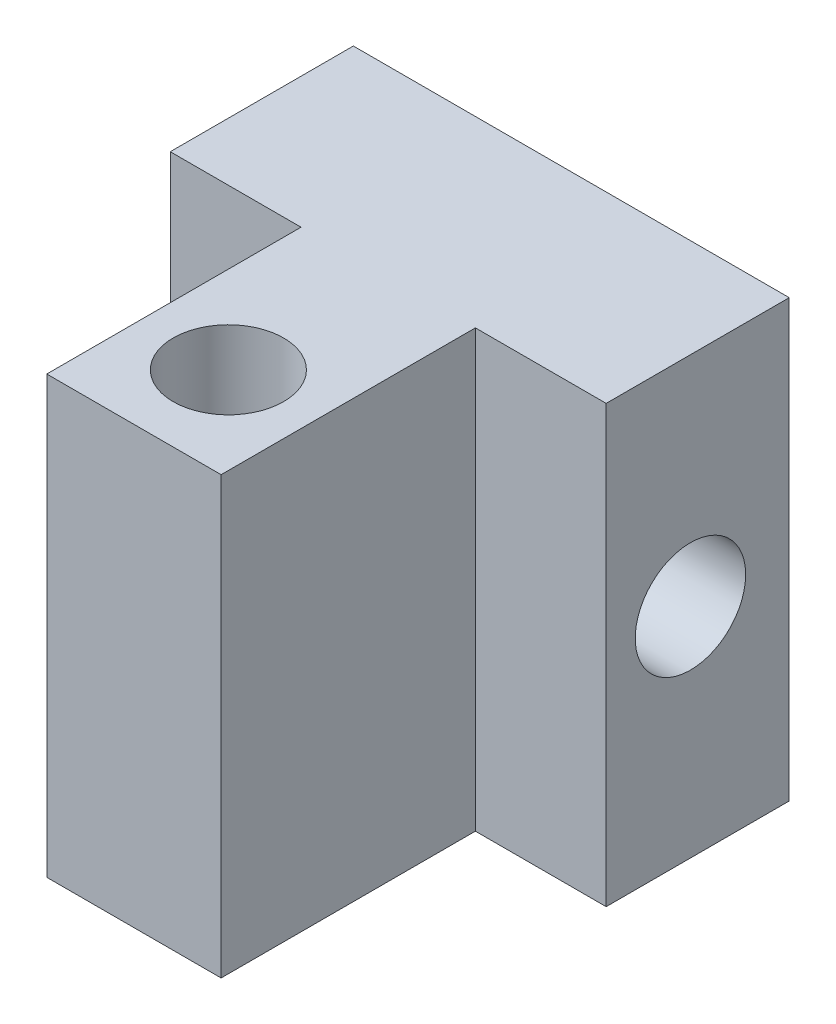
ISO-10303-21;
HEADER;
FILE_DESCRIPTION(('STEP AP214'),'2;1');
FILE_NAME('part.step','',(''),(''),'','','');
FILE_SCHEMA(('AUTOMOTIVE_DESIGN { 1 0 10303 214 1 1 1 1 }'));
ENDSEC;
DATA;
#1=APPLICATION_CONTEXT('core data for automotive mechanical design processes');
#2=APPLICATION_PROTOCOL_DEFINITION('international standard','automotive_design',2000,#1);
#3=PRODUCT_CONTEXT('',#1,'mechanical');
#4=PRODUCT('Part','Part','',(#3));
#5=PRODUCT_RELATED_PRODUCT_CATEGORY('part','',(#4));
#6=PRODUCT_DEFINITION_FORMATION('','',#4);
#7=PRODUCT_DEFINITION_CONTEXT('part definition',#1,'design');
#8=PRODUCT_DEFINITION('design','',#6,#7);
#9=PRODUCT_DEFINITION_SHAPE('','',#8);
#10=(LENGTH_UNIT() NAMED_UNIT(*) SI_UNIT(.MILLI.,.METRE.));
#11=(NAMED_UNIT(*) PLANE_ANGLE_UNIT() SI_UNIT($,.RADIAN.));
#12=(NAMED_UNIT(*) SI_UNIT($,.STERADIAN.) SOLID_ANGLE_UNIT());
#13=UNCERTAINTY_MEASURE_WITH_UNIT(LENGTH_MEASURE(1.E-05),#10,'distance_accuracy_value','');
#14=(GEOMETRIC_REPRESENTATION_CONTEXT(3) GLOBAL_UNCERTAINTY_ASSIGNED_CONTEXT((#13)) GLOBAL_UNIT_ASSIGNED_CONTEXT((#10,
#11,#12)) REPRESENTATION_CONTEXT('',''));
#15=CARTESIAN_POINT('',(0.,0.,0.));
#16=DIRECTION('',(0.,0.,1.));
#17=DIRECTION('',(1.,0.,0.));
#18=AXIS2_PLACEMENT_3D('',#15,#16,#17);
#19=CARTESIAN_POINT('',(-60.,0.,60.2));
#20=DIRECTION('',(1.,0.,0.));
#21=DIRECTION('',(0.,1.,0.));
#22=AXIS2_PLACEMENT_3D('',#19,#20,#21);
#23=PLANE('',#22);
#24=CARTESIAN_POINT('',(-60.,30.,13.6));
#25=DIRECTION('',(1.,0.,0.));
#26=DIRECTION('',(0.,0.,-1.));
#27=AXIS2_PLACEMENT_3D('',#24,#25,#26);
#28=CIRCLE('',#27,7.60000000000001);
#29=CARTESIAN_POINT('',(-60.,30.,5.99999999999999));
#30=VERTEX_POINT('',#29);
#31=EDGE_CURVE('E142',#30,#30,#28,.T.);
#32=ORIENTED_EDGE('',*,*,#31,.T.);
#33=EDGE_LOOP('',(#32));
#34=FACE_BOUND('',#33,.T.);
#35=DIRECTION('',(0.,-1.,0.));
#36=VECTOR('',#35,1.);
#37=CARTESIAN_POINT('',(-60.,60.,25.2));
#38=LINE('',#37,#36);
#39=CARTESIAN_POINT('',(-60.,60.,25.2));
#40=VERTEX_POINT('',#39);
#41=CARTESIAN_POINT('',(-60.,0.,25.2));
#42=VERTEX_POINT('',#41);
#43=EDGE_CURVE('E170',#40,#42,#38,.T.);
#44=ORIENTED_EDGE('',*,*,#43,.F.);
#45=DIRECTION('',(0.,0.,-1.));
#46=VECTOR('',#45,1.);
#47=CARTESIAN_POINT('',(-60.,60.,60.2));
#48=LINE('',#47,#46);
#49=CARTESIAN_POINT('',(-60.,60.,0.));
#50=VERTEX_POINT('',#49);
#51=EDGE_CURVE('E126',#40,#50,#48,.T.);
#52=ORIENTED_EDGE('',*,*,#51,.T.);
#53=DIRECTION('',(0.,-1.,0.));
#54=VECTOR('',#53,1.);
#55=CARTESIAN_POINT('',(-60.,0.,0.));
#56=LINE('',#55,#54);
#57=CARTESIAN_POINT('',(-60.,0.,0.));
#58=VERTEX_POINT('',#57);
#59=EDGE_CURVE('E132',#50,#58,#56,.T.);
#60=ORIENTED_EDGE('',*,*,#59,.T.);
#61=DIRECTION('',(0.,0.,-1.));
#62=VECTOR('',#61,1.);
#63=CARTESIAN_POINT('',(-60.,0.,60.2));
#64=LINE('',#63,#62);
#65=EDGE_CURVE('E127',#42,#58,#64,.T.);
#66=ORIENTED_EDGE('',*,*,#65,.F.);
#67=EDGE_LOOP('',(#44,#52,#60,#66));
#68=FACE_BOUND('',#67,.T.);
#69=ADVANCED_FACE('F36',(#34,#68),#23,.F.);
#70=CARTESIAN_POINT('',(0.,0.,60.2));
#71=DIRECTION('',(0.,1.,0.));
#72=DIRECTION('',(-1.,0.,0.));
#73=AXIS2_PLACEMENT_3D('',#70,#71,#72);
#74=PLANE('',#73);
#75=DIRECTION('',(1.,0.,0.));
#76=VECTOR('',#75,1.);
#77=CARTESIAN_POINT('',(0.,0.,25.2));
#78=LINE('',#77,#76);
#79=CARTESIAN_POINT('',(-18.,0.,25.2));
#80=VERTEX_POINT('',#79);
#81=CARTESIAN_POINT('',(0.,0.,25.2));
#82=VERTEX_POINT('',#81);
#83=EDGE_CURVE('E108',#80,#82,#78,.T.);
#84=ORIENTED_EDGE('',*,*,#83,.F.);
#85=DIRECTION('',(0.,0.,1.));
#86=VECTOR('',#85,1.);
#87=CARTESIAN_POINT('',(-18.,0.,25.2));
#88=LINE('',#87,#86);
#89=CARTESIAN_POINT('',(-18.,0.,60.2));
#90=VERTEX_POINT('',#89);
#91=EDGE_CURVE('E165',#80,#90,#88,.T.);
#92=ORIENTED_EDGE('',*,*,#91,.T.);
#93=DIRECTION('',(1.,0.,0.));
#94=VECTOR('',#93,1.);
#95=CARTESIAN_POINT('',(0.,0.,60.2));
#96=LINE('',#95,#94);
#97=CARTESIAN_POINT('',(-42.,0.,60.2));
#98=VERTEX_POINT('',#97);
#99=EDGE_CURVE('E135',#98,#90,#96,.T.);
#100=ORIENTED_EDGE('',*,*,#99,.F.);
#101=DIRECTION('',(0.,0.,1.));
#102=VECTOR('',#101,1.);
#103=CARTESIAN_POINT('',(-42.,0.,25.2));
#104=LINE('',#103,#102);
#105=CARTESIAN_POINT('',(-42.,0.,25.2));
#106=VERTEX_POINT('',#105);
#107=EDGE_CURVE('E59',#106,#98,#104,.T.);
#108=ORIENTED_EDGE('',*,*,#107,.F.);
#109=DIRECTION('',(1.,0.,0.));
#110=VECTOR('',#109,1.);
#111=CARTESIAN_POINT('',(-60.,0.,25.2));
#112=LINE('',#111,#110);
#113=EDGE_CURVE('E168',#42,#106,#112,.T.);
#114=ORIENTED_EDGE('',*,*,#113,.F.);
#115=ORIENTED_EDGE('',*,*,#65,.T.);
#116=DIRECTION('',(1.,0.,0.));
#117=VECTOR('',#116,1.);
#118=CARTESIAN_POINT('',(0.,0.,0.));
#119=LINE('',#118,#117);
#120=CARTESIAN_POINT('',(0.,0.,0.));
#121=VERTEX_POINT('',#120);
#122=EDGE_CURVE('E139',#58,#121,#119,.T.);
#123=ORIENTED_EDGE('',*,*,#122,.T.);
#124=DIRECTION('',(0.,0.,-1.));
#125=VECTOR('',#124,1.);
#126=CARTESIAN_POINT('',(0.,0.,60.2));
#127=LINE('',#126,#125);
#128=EDGE_CURVE('E11',#82,#121,#127,.T.);
#129=ORIENTED_EDGE('',*,*,#128,.F.);
#130=EDGE_LOOP('',(#84,#92,#100,#108,#114,#115,#123,#129));
#131=FACE_BOUND('',#130,.T.);
#132=CARTESIAN_POINT('',(-30.,0.,47.2));
#133=DIRECTION('',(0.,-1.,0.));
#134=DIRECTION('',(1.,0.,0.));
#135=AXIS2_PLACEMENT_3D('',#132,#133,#134);
#136=CIRCLE('',#135,7.6);
#137=CARTESIAN_POINT('',(-30.,0.,54.8));
#138=VERTEX_POINT('',#137);
#139=EDGE_CURVE('E149',#138,#138,#136,.T.);
#140=ORIENTED_EDGE('',*,*,#139,.F.);
#141=EDGE_LOOP('',(#140));
#142=FACE_BOUND('',#141,.T.);
#143=ADVANCED_FACE('F38',(#131,#142),#74,.F.);
#144=CARTESIAN_POINT('',(-60.,60.,60.2));
#145=DIRECTION('',(0.,-1.,0.));
#146=DIRECTION('',(1.,0.,0.));
#147=AXIS2_PLACEMENT_3D('',#144,#145,#146);
#148=PLANE('',#147);
#149=DIRECTION('',(-1.,0.,0.));
#150=VECTOR('',#149,1.);
#151=CARTESIAN_POINT('',(-60.,60.,60.2));
#152=LINE('',#151,#150);
#153=CARTESIAN_POINT('',(-18.,60.,60.2));
#154=VERTEX_POINT('',#153);
#155=CARTESIAN_POINT('',(-42.,60.,60.2));
#156=VERTEX_POINT('',#155);
#157=EDGE_CURVE('E131',#154,#156,#152,.T.);
#158=ORIENTED_EDGE('',*,*,#157,.F.);
#159=DIRECTION('',(0.,0.,1.));
#160=VECTOR('',#159,1.);
#161=CARTESIAN_POINT('',(-18.,60.,25.2));
#162=LINE('',#161,#160);
#163=CARTESIAN_POINT('',(-18.,60.,25.2));
#164=VERTEX_POINT('',#163);
#165=EDGE_CURVE('E51',#164,#154,#162,.T.);
#166=ORIENTED_EDGE('',*,*,#165,.F.);
#167=DIRECTION('',(-1.,0.,0.));
#168=VECTOR('',#167,1.);
#169=CARTESIAN_POINT('',(-18.,60.,25.2));
#170=LINE('',#169,#168);
#171=CARTESIAN_POINT('',(0.,60.,25.2));
#172=VERTEX_POINT('',#171);
#173=EDGE_CURVE('E106',#172,#164,#170,.T.);
#174=ORIENTED_EDGE('',*,*,#173,.F.);
#175=DIRECTION('',(0.,0.,-1.));
#176=VECTOR('',#175,1.);
#177=CARTESIAN_POINT('',(0.,60.,60.2));
#178=LINE('',#177,#176);
#179=CARTESIAN_POINT('',(0.,60.,0.));
#180=VERTEX_POINT('',#179);
#181=EDGE_CURVE('E44',#172,#180,#178,.T.);
#182=ORIENTED_EDGE('',*,*,#181,.T.);
#183=DIRECTION('',(-1.,0.,0.));
#184=VECTOR('',#183,1.);
#185=CARTESIAN_POINT('',(-60.,60.,0.));
#186=LINE('',#185,#184);
#187=EDGE_CURVE('E136',#180,#50,#186,.T.);
#188=ORIENTED_EDGE('',*,*,#187,.T.);
#189=ORIENTED_EDGE('',*,*,#51,.F.);
#190=DIRECTION('',(-1.,0.,0.));
#191=VECTOR('',#190,1.);
#192=CARTESIAN_POINT('',(-42.,60.,25.2));
#193=LINE('',#192,#191);
#194=CARTESIAN_POINT('',(-42.,60.,25.2));
#195=VERTEX_POINT('',#194);
#196=EDGE_CURVE('E164',#195,#40,#193,.T.);
#197=ORIENTED_EDGE('',*,*,#196,.F.);
#198=DIRECTION('',(0.,0.,1.));
#199=VECTOR('',#198,1.);
#200=CARTESIAN_POINT('',(-42.,60.,25.2));
#201=LINE('',#200,#199);
#202=EDGE_CURVE('E155',#195,#156,#201,.T.);
#203=ORIENTED_EDGE('',*,*,#202,.T.);
#204=EDGE_LOOP('',(#158,#166,#174,#182,#188,#189,#197,#203));
#205=FACE_BOUND('',#204,.T.);
#206=CARTESIAN_POINT('',(-30.,60.,47.2));
#207=DIRECTION('',(0.,-1.,0.));
#208=DIRECTION('',(1.,0.,0.));
#209=AXIS2_PLACEMENT_3D('',#206,#207,#208);
#210=CIRCLE('',#209,7.6);
#211=CARTESIAN_POINT('',(-30.,60.,54.8));
#212=VERTEX_POINT('',#211);
#213=EDGE_CURVE('E152',#212,#212,#210,.T.);
#214=ORIENTED_EDGE('',*,*,#213,.T.);
#215=EDGE_LOOP('',(#214));
#216=FACE_BOUND('',#215,.T.);
#217=ADVANCED_FACE('F116',(#205,#216),#148,.F.);
#218=CARTESIAN_POINT('',(0.,0.,60.2));
#219=DIRECTION('',(-1.,0.,0.));
#220=DIRECTION('',(0.,0.,1.));
#221=AXIS2_PLACEMENT_3D('',#218,#219,#220);
#222=PLANE('',#221);
#223=CARTESIAN_POINT('',(0.,30.,13.6));
#224=DIRECTION('',(1.,0.,0.));
#225=DIRECTION('',(0.,0.,-1.));
#226=AXIS2_PLACEMENT_3D('',#223,#224,#225);
#227=CIRCLE('',#226,7.60000000000001);
#228=CARTESIAN_POINT('',(0.,30.,5.99999999999999));
#229=VERTEX_POINT('',#228);
#230=EDGE_CURVE('E146',#229,#229,#227,.T.);
#231=ORIENTED_EDGE('',*,*,#230,.F.);
#232=EDGE_LOOP('',(#231));
#233=FACE_BOUND('',#232,.T.);
#234=ORIENTED_EDGE('',*,*,#181,.F.);
#235=DIRECTION('',(0.,1.,0.));
#236=VECTOR('',#235,1.);
#237=CARTESIAN_POINT('',(0.,60.,25.2));
#238=LINE('',#237,#236);
#239=EDGE_CURVE('E102',#82,#172,#238,.T.);
#240=ORIENTED_EDGE('',*,*,#239,.F.);
#241=ORIENTED_EDGE('',*,*,#128,.T.);
#242=DIRECTION('',(0.,1.,0.));
#243=VECTOR('',#242,1.);
#244=CARTESIAN_POINT('',(0.,0.,0.));
#245=LINE('',#244,#243);
#246=EDGE_CURVE('E124',#121,#180,#245,.T.);
#247=ORIENTED_EDGE('',*,*,#246,.T.);
#248=EDGE_LOOP('',(#234,#240,#241,#247));
#249=FACE_BOUND('',#248,.T.);
#250=ADVANCED_FACE('F122',(#233,#249),#222,.F.);
#251=CARTESIAN_POINT('',(0.,0.,60.2));
#252=DIRECTION('',(0.,0.,-1.));
#253=DIRECTION('',(-1.,0.,0.));
#254=AXIS2_PLACEMENT_3D('',#251,#252,#253);
#255=PLANE('',#254);
#256=ORIENTED_EDGE('',*,*,#99,.T.);
#257=DIRECTION('',(0.,-1.,0.));
#258=VECTOR('',#257,1.);
#259=CARTESIAN_POINT('',(-18.,60.,60.2));
#260=LINE('',#259,#258);
#261=EDGE_CURVE('E112',#154,#90,#260,.T.);
#262=ORIENTED_EDGE('',*,*,#261,.F.);
#263=ORIENTED_EDGE('',*,*,#157,.T.);
#264=DIRECTION('',(0.,1.,0.));
#265=VECTOR('',#264,1.);
#266=CARTESIAN_POINT('',(-42.,60.,60.2));
#267=LINE('',#266,#265);
#268=EDGE_CURVE('E162',#98,#156,#267,.T.);
#269=ORIENTED_EDGE('',*,*,#268,.F.);
#270=EDGE_LOOP('',(#256,#262,#263,#269));
#271=FACE_BOUND('',#270,.T.);
#272=ADVANCED_FACE('F194',(#271),#255,.F.);
#273=CARTESIAN_POINT('',(0.,0.,0.));
#274=DIRECTION('',(0.,0.,-1.));
#275=DIRECTION('',(-1.,0.,0.));
#276=AXIS2_PLACEMENT_3D('',#273,#274,#275);
#277=PLANE('',#276);
#278=ORIENTED_EDGE('',*,*,#122,.F.);
#279=ORIENTED_EDGE('',*,*,#59,.F.);
#280=ORIENTED_EDGE('',*,*,#187,.F.);
#281=ORIENTED_EDGE('',*,*,#246,.F.);
#282=EDGE_LOOP('',(#278,#279,#280,#281));
#283=FACE_BOUND('',#282,.T.);
#284=ADVANCED_FACE('F183',(#283),#277,.T.);
#285=CARTESIAN_POINT('',(-60.,30.,13.6));
#286=DIRECTION('',(1.,0.,0.));
#287=DIRECTION('',(0.,0.,-1.));
#288=AXIS2_PLACEMENT_3D('',#285,#286,#287);
#289=CYLINDRICAL_SURFACE('',#288,7.60000000000001);
#290=ORIENTED_EDGE('',*,*,#31,.F.);
#291=EDGE_LOOP('',(#290));
#292=FACE_BOUND('',#291,.T.);
#293=ORIENTED_EDGE('',*,*,#230,.T.);
#294=EDGE_LOOP('',(#293));
#295=FACE_BOUND('',#294,.T.);
#296=ADVANCED_FACE('F205',(#292,#295),#289,.F.);
#297=CARTESIAN_POINT('',(-30.,0.,47.2));
#298=DIRECTION('',(0.,1.,0.));
#299=DIRECTION('',(0.,0.,1.));
#300=AXIS2_PLACEMENT_3D('',#297,#298,#299);
#301=CYLINDRICAL_SURFACE('',#300,7.6);
#302=CARTESIAN_POINT('',(-30.,0.,54.8));
#303=CARTESIAN_POINT('',(-30.,0.624999999999986,54.8));
#304=CARTESIAN_POINT('',(-30.,1.24999999999999,54.8));
#305=CARTESIAN_POINT('',(-30.,2.49999999999999,54.8));
#306=CARTESIAN_POINT('',(-30.,3.12499999999999,54.8));
#307=CARTESIAN_POINT('',(-30.,4.37499999999999,54.8));
#308=CARTESIAN_POINT('',(-30.,4.99999999999999,54.8));
#309=CARTESIAN_POINT('',(-30.,6.24999999999999,54.8));
#310=CARTESIAN_POINT('',(-30.,6.87499999999998,54.8));
#311=CARTESIAN_POINT('',(-30.,8.12499999999999,54.8));
#312=CARTESIAN_POINT('',(-30.,8.74999999999999,54.8));
#313=CARTESIAN_POINT('',(-30.,9.99999999999999,54.8));
#314=CARTESIAN_POINT('',(-30.,10.625,54.8));
#315=CARTESIAN_POINT('',(-30.,11.875,54.8));
#316=CARTESIAN_POINT('',(-30.,12.5,54.8));
#317=CARTESIAN_POINT('',(-30.,13.75,54.8));
#318=CARTESIAN_POINT('',(-30.,14.375,54.8));
#319=CARTESIAN_POINT('',(-30.,15.625,54.8));
#320=CARTESIAN_POINT('',(-30.,16.25,54.8));
#321=CARTESIAN_POINT('',(-30.,17.5,54.8));
#322=CARTESIAN_POINT('',(-30.,18.125,54.8));
#323=CARTESIAN_POINT('',(-30.,19.375,54.8));
#324=CARTESIAN_POINT('',(-30.,20.,54.8));
#325=CARTESIAN_POINT('',(-30.,21.25,54.8));
#326=CARTESIAN_POINT('',(-30.,21.875,54.8));
#327=CARTESIAN_POINT('',(-30.,23.125,54.8));
#328=CARTESIAN_POINT('',(-30.,23.75,54.8));
#329=CARTESIAN_POINT('',(-30.,25.,54.8));
#330=CARTESIAN_POINT('',(-30.,25.625,54.8));
#331=CARTESIAN_POINT('',(-30.,26.875,54.8));
#332=CARTESIAN_POINT('',(-30.,27.5,54.8));
#333=CARTESIAN_POINT('',(-30.,28.75,54.8));
#334=CARTESIAN_POINT('',(-30.,29.375,54.8));
#335=CARTESIAN_POINT('',(-30.,30.625,54.8));
#336=CARTESIAN_POINT('',(-30.,31.25,54.8));
#337=CARTESIAN_POINT('',(-30.,32.5,54.8));
#338=CARTESIAN_POINT('',(-30.,33.125,54.8));
#339=CARTESIAN_POINT('',(-30.,34.375,54.8));
#340=CARTESIAN_POINT('',(-30.,35.,54.8));
#341=CARTESIAN_POINT('',(-30.,36.25,54.8));
#342=CARTESIAN_POINT('',(-30.,36.875,54.8));
#343=CARTESIAN_POINT('',(-30.,38.125,54.8));
#344=CARTESIAN_POINT('',(-30.,38.75,54.8));
#345=CARTESIAN_POINT('',(-30.,40.,54.8));
#346=CARTESIAN_POINT('',(-30.,40.625,54.8));
#347=CARTESIAN_POINT('',(-30.,41.875,54.8));
#348=CARTESIAN_POINT('',(-30.,42.5,54.8));
#349=CARTESIAN_POINT('',(-30.,43.75,54.8));
#350=CARTESIAN_POINT('',(-30.,44.375,54.8));
#351=CARTESIAN_POINT('',(-30.,45.625,54.8));
#352=CARTESIAN_POINT('',(-30.,46.25,54.8));
#353=CARTESIAN_POINT('',(-30.,47.5,54.8));
#354=CARTESIAN_POINT('',(-30.,48.125,54.8));
#355=CARTESIAN_POINT('',(-30.,49.375,54.8));
#356=CARTESIAN_POINT('',(-30.,50.,54.8));
#357=CARTESIAN_POINT('',(-30.,51.25,54.8));
#358=CARTESIAN_POINT('',(-30.,51.875,54.8));
#359=CARTESIAN_POINT('',(-30.,53.125,54.8));
#360=CARTESIAN_POINT('',(-30.,53.75,54.8));
#361=CARTESIAN_POINT('',(-30.,55.,54.8));
#362=CARTESIAN_POINT('',(-30.,55.625,54.8));
#363=CARTESIAN_POINT('',(-30.,56.875,54.8));
#364=CARTESIAN_POINT('',(-30.,57.5,54.8));
#365=CARTESIAN_POINT('',(-30.,58.75,54.8));
#366=CARTESIAN_POINT('',(-30.,59.375,54.8));
#367=CARTESIAN_POINT('',(-30.,60.,54.8));
#368=B_SPLINE_CURVE_WITH_KNOTS('',3,(#302,#303,#304,#305,#306,#307,#308,#309,#310,#311,#312,
#313,#314,#315,#316,#317,#318,#319,#320,#321,#322,#323,#324,#325,#326,#327,#328,#329,#330,#331,
#332,#333,#334,#335,#336,#337,#338,#339,#340,#341,#342,#343,#344,#345,#346,#347,#348,#349,#350,
#351,#352,#353,#354,#355,#356,#357,#358,#359,#360,#361,#362,#363,#364,#365,#366,#367),
.UNSPECIFIED.,.F.,.F.,(4,2,2,2,2,2,2,2,2,2,2,2,2,2,2,2,2,2,2,2,2,2,2,2,2,2,2,2,2,2,2,2,4),(0.,
1.875,3.75,5.625,7.5,9.375,11.25,13.125,15.,16.875,18.75,20.625,22.5,24.375,26.25,28.125,30.,
31.875,33.75,35.625,37.5,39.375,41.25,43.125,45.,46.875,48.75,50.625,52.5,54.375,56.25,58.125,
60.),.UNSPECIFIED.);
#369=EDGE_CURVE('BSEAM197',#138,#212,#368,.T.);
#370=ORIENTED_EDGE('',*,*,#139,.T.);
#371=ORIENTED_EDGE('',*,*,#213,.F.);
#372=ORIENTED_EDGE('',*,*,#369,.T.);
#373=ORIENTED_EDGE('',*,*,#369,.F.);
#374=EDGE_LOOP('',(#370,#372,#371,#373));
#375=FACE_BOUND('',#374,.T.);
#376=ADVANCED_FACE('F197',(#375),#301,.F.);
#377=CARTESIAN_POINT('',(-42.,60.,25.2));
#378=DIRECTION('',(1.,0.,0.));
#379=DIRECTION('',(0.,1.,0.));
#380=AXIS2_PLACEMENT_3D('',#377,#378,#379);
#381=PLANE('',#380);
#382=ORIENTED_EDGE('',*,*,#268,.T.);
#383=ORIENTED_EDGE('',*,*,#202,.F.);
#384=DIRECTION('',(0.,1.,0.));
#385=VECTOR('',#384,1.);
#386=CARTESIAN_POINT('',(-42.,60.,25.2));
#387=LINE('',#386,#385);
#388=EDGE_CURVE('E159',#106,#195,#387,.T.);
#389=ORIENTED_EDGE('',*,*,#388,.F.);
#390=ORIENTED_EDGE('',*,*,#107,.T.);
#391=EDGE_LOOP('',(#382,#383,#389,#390));
#392=FACE_BOUND('',#391,.T.);
#393=ADVANCED_FACE('F195',(#392),#381,.F.);
#394=CARTESIAN_POINT('',(0.,0.,25.2));
#395=DIRECTION('',(0.,0.,1.));
#396=DIRECTION('',(1.,0.,0.));
#397=AXIS2_PLACEMENT_3D('',#394,#395,#396);
#398=PLANE('',#397);
#399=ORIENTED_EDGE('',*,*,#196,.T.);
#400=ORIENTED_EDGE('',*,*,#43,.T.);
#401=ORIENTED_EDGE('',*,*,#113,.T.);
#402=ORIENTED_EDGE('',*,*,#388,.T.);
#403=EDGE_LOOP('',(#399,#400,#401,#402));
#404=FACE_BOUND('',#403,.T.);
#405=ADVANCED_FACE('F192',(#404),#398,.T.);
#406=CARTESIAN_POINT('',(-18.,60.,25.2));
#407=DIRECTION('',(-1.,0.,0.));
#408=DIRECTION('',(0.,-1.,0.));
#409=AXIS2_PLACEMENT_3D('',#406,#407,#408);
#410=PLANE('',#409);
#411=ORIENTED_EDGE('',*,*,#261,.T.);
#412=ORIENTED_EDGE('',*,*,#91,.F.);
#413=DIRECTION('',(0.,-1.,0.));
#414=VECTOR('',#413,1.);
#415=CARTESIAN_POINT('',(-18.,60.,25.2));
#416=LINE('',#415,#414);
#417=EDGE_CURVE('E120',#164,#80,#416,.T.);
#418=ORIENTED_EDGE('',*,*,#417,.F.);
#419=ORIENTED_EDGE('',*,*,#165,.T.);
#420=EDGE_LOOP('',(#411,#412,#418,#419));
#421=FACE_BOUND('',#420,.T.);
#422=ADVANCED_FACE('F203',(#421),#410,.F.);
#423=CARTESIAN_POINT('',(0.,0.,25.2));
#424=DIRECTION('',(0.,0.,-1.));
#425=DIRECTION('',(-1.,0.,0.));
#426=AXIS2_PLACEMENT_3D('',#423,#424,#425);
#427=PLANE('',#426);
#428=ORIENTED_EDGE('',*,*,#239,.T.);
#429=ORIENTED_EDGE('',*,*,#173,.T.);
#430=ORIENTED_EDGE('',*,*,#417,.T.);
#431=ORIENTED_EDGE('',*,*,#83,.T.);
#432=EDGE_LOOP('',(#428,#429,#430,#431));
#433=FACE_BOUND('',#432,.T.);
#434=ADVANCED_FACE('F104',(#433),#427,.F.);
#435=CLOSED_SHELL('',(#69,#143,#217,#250,#272,#284,#296,#376,#393,#405,#422,#434));
#436=MANIFOLD_SOLID_BREP('B2',#435);
#437=ADVANCED_BREP_SHAPE_REPRESENTATION('',(#18,#436),#14);
#438=SHAPE_DEFINITION_REPRESENTATION(#9,#437);
ENDSEC;
END-ISO-10303-21;
